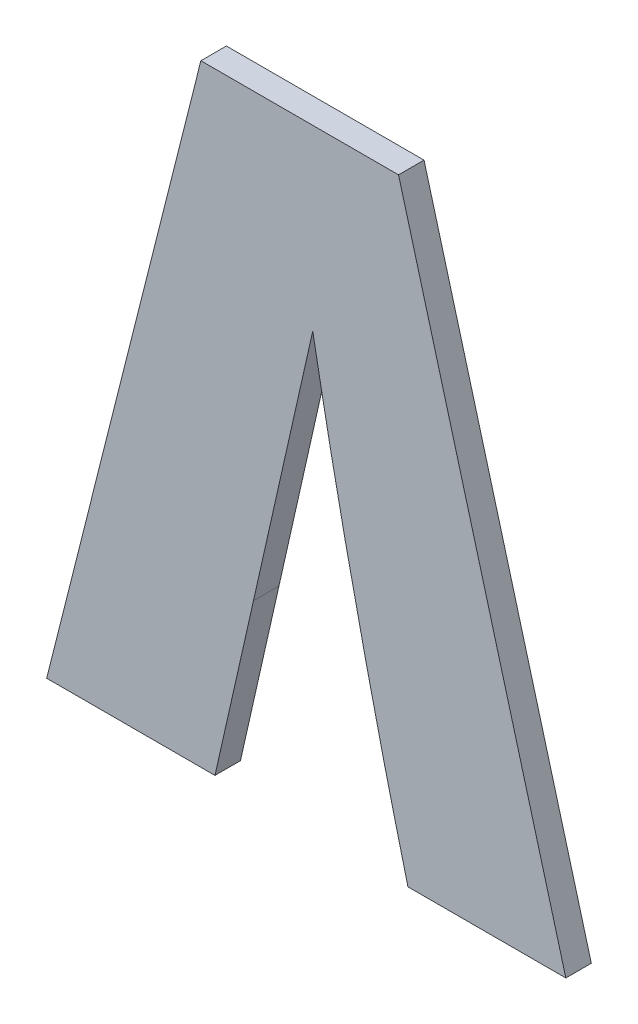
ISO-10303-21;
HEADER;
FILE_DESCRIPTION(('STEP AP214'),'2;1');
FILE_NAME('part.step','',(''),(''),'','','');
FILE_SCHEMA(('AUTOMOTIVE_DESIGN { 1 0 10303 214 1 1 1 1 }'));
ENDSEC;
DATA;
#1=APPLICATION_CONTEXT('core data for automotive mechanical design processes');
#2=APPLICATION_PROTOCOL_DEFINITION('international standard','automotive_design',2000,#1);
#3=PRODUCT_CONTEXT('',#1,'mechanical');
#4=PRODUCT('Part','Part','',(#3));
#5=PRODUCT_RELATED_PRODUCT_CATEGORY('part','',(#4));
#6=PRODUCT_DEFINITION_FORMATION('','',#4);
#7=PRODUCT_DEFINITION_CONTEXT('part definition',#1,'design');
#8=PRODUCT_DEFINITION('design','',#6,#7);
#9=PRODUCT_DEFINITION_SHAPE('','',#8);
#10=(LENGTH_UNIT() NAMED_UNIT(*) SI_UNIT(.MILLI.,.METRE.));
#11=(NAMED_UNIT(*) PLANE_ANGLE_UNIT() SI_UNIT($,.RADIAN.));
#12=(NAMED_UNIT(*) SI_UNIT($,.STERADIAN.) SOLID_ANGLE_UNIT());
#13=UNCERTAINTY_MEASURE_WITH_UNIT(LENGTH_MEASURE(1.E-05),#10,'distance_accuracy_value','');
#14=(GEOMETRIC_REPRESENTATION_CONTEXT(3) GLOBAL_UNCERTAINTY_ASSIGNED_CONTEXT((#13)) GLOBAL_UNIT_ASSIGNED_CONTEXT((#10,
#11,#12)) REPRESENTATION_CONTEXT('',''));
#15=CARTESIAN_POINT('',(0.,0.,0.));
#16=DIRECTION('',(0.,0.,1.));
#17=DIRECTION('',(1.,0.,0.));
#18=AXIS2_PLACEMENT_3D('',#15,#16,#17);
#19=CARTESIAN_POINT('',(-10.2063301282051,12.5,0.5));
#20=DIRECTION('',(0.,-1.,0.));
#21=DIRECTION('',(0.,0.,-1.));
#22=AXIS2_PLACEMENT_3D('',#19,#20,#21);
#23=PLANE('',#22);
#24=DIRECTION('',(1.,0.,0.));
#25=VECTOR('',#24,1.);
#26=CARTESIAN_POINT('',(-10.2063301282051,12.5,1.));
#27=LINE('',#26,#25);
#28=CARTESIAN_POINT('',(-10.2063301282051,12.5,1.));
#29=VERTEX_POINT('',#28);
#30=CARTESIAN_POINT('',(-6.33012820512821,12.5,1.));
#31=VERTEX_POINT('',#30);
#32=EDGE_CURVE('E121',#29,#31,#27,.T.);
#33=ORIENTED_EDGE('',*,*,#32,.T.);
#34=DIRECTION('',(0.,0.,1.));
#35=VECTOR('',#34,1.);
#36=CARTESIAN_POINT('',(-6.33012820512821,12.5,0.5));
#37=LINE('',#36,#35);
#38=CARTESIAN_POINT('',(-6.33012820512821,12.5,0.5));
#39=VERTEX_POINT('',#38);
#40=EDGE_CURVE('E134',#39,#31,#37,.T.);
#41=ORIENTED_EDGE('',*,*,#40,.F.);
#42=DIRECTION('',(1.,0.,0.));
#43=VECTOR('',#42,1.);
#44=CARTESIAN_POINT('',(-10.2063301282051,12.5,0.5));
#45=LINE('',#44,#43);
#46=CARTESIAN_POINT('',(-10.2063301282051,12.5,0.5));
#47=VERTEX_POINT('',#46);
#48=EDGE_CURVE('E210',#47,#39,#45,.T.);
#49=ORIENTED_EDGE('',*,*,#48,.F.);
#50=DIRECTION('',(0.,0.,1.));
#51=VECTOR('',#50,1.);
#52=CARTESIAN_POINT('',(-10.2063301282051,12.5,0.5));
#53=LINE('',#52,#51);
#54=EDGE_CURVE('E138',#47,#29,#53,.T.);
#55=ORIENTED_EDGE('',*,*,#54,.T.);
#56=EDGE_LOOP('',(#33,#41,#49,#55));
#57=FACE_BOUND('',#56,.T.);
#58=ADVANCED_FACE('F39',(#57),#23,.F.);
#59=CARTESIAN_POINT('',(-8.01282051282052,9.00440705128206,0.5));
#60=CARTESIAN_POINT('',(-8.09660975203797,8.63555596973446,0.5));
#61=CARTESIAN_POINT('',(-8.27361341265292,7.85636293414345,0.5));
#62=CARTESIAN_POINT('',(-8.54581373180322,6.62662536011861,0.5));
#63=CARTESIAN_POINT('',(-8.85474960034038,5.27728414158836,0.5));
#64=CARTESIAN_POINT('',(-9.06494207937523,4.33703805332426,0.5));
#65=CARTESIAN_POINT('',(-9.1746794871795,3.84615384615385,0.5));
#66=B_SPLINE_CURVE_WITH_KNOTS('',3,(#59,#60,#61,#62,#63,#64,#65),.UNSPECIFIED.,.F.,.F.,(4,1,1,1,
4),(0.,0.214609114344812,0.453358918103799,0.714609316175079,1.),.UNSPECIFIED.);
#67=DIRECTION('',(0.,0.,1.));
#68=VECTOR('',#67,1.);
#69=SURFACE_OF_LINEAR_EXTRUSION('',#66,#68);
#70=CARTESIAN_POINT('',(-8.01282051282052,9.00440705128206,1.));
#71=CARTESIAN_POINT('',(-8.09660975203797,8.63555596973446,1.));
#72=CARTESIAN_POINT('',(-8.27361341265292,7.85636293414345,1.));
#73=CARTESIAN_POINT('',(-8.54581373180322,6.62662536011861,1.));
#74=CARTESIAN_POINT('',(-8.85474960034038,5.27728414158836,1.));
#75=CARTESIAN_POINT('',(-9.06494207937523,4.33703805332426,1.));
#76=CARTESIAN_POINT('',(-9.1746794871795,3.84615384615385,1.));
#77=B_SPLINE_CURVE_WITH_KNOTS('',3,(#70,#71,#72,#73,#74,#75,#76),.UNSPECIFIED.,.F.,.F.,(4,1,1,1,
4),(0.,0.214609114344812,0.453358918103799,0.714609316175079,1.),.UNSPECIFIED.);
#78=CARTESIAN_POINT('',(-8.01282051282052,9.00440705128205,1.));
#79=VERTEX_POINT('',#78);
#80=CARTESIAN_POINT('',(-9.1746794871795,3.84615384615385,1.));
#81=VERTEX_POINT('',#80);
#82=EDGE_CURVE('E126',#79,#81,#77,.T.);
#83=ORIENTED_EDGE('',*,*,#82,.T.);
#84=DIRECTION('',(0.,0.,1.));
#85=VECTOR('',#84,1.);
#86=CARTESIAN_POINT('',(-9.1746794871795,3.84615384615385,0.5));
#87=LINE('',#86,#85);
#88=CARTESIAN_POINT('',(-9.1746794871795,3.84615384615385,0.5));
#89=VERTEX_POINT('',#88);
#90=EDGE_CURVE('E139',#89,#81,#87,.T.);
#91=ORIENTED_EDGE('',*,*,#90,.F.);
#92=CARTESIAN_POINT('',(-8.01282051282052,9.00440705128205,0.5));
#93=VERTEX_POINT('',#92);
#94=EDGE_CURVE('E161',#93,#89,#66,.T.);
#95=ORIENTED_EDGE('',*,*,#94,.F.);
#96=DIRECTION('',(0.,0.,1.));
#97=VECTOR('',#96,1.);
#98=CARTESIAN_POINT('',(-8.01282051282052,9.00440705128205,0.5));
#99=LINE('',#98,#97);
#100=EDGE_CURVE('E42',#93,#79,#99,.T.);
#101=ORIENTED_EDGE('',*,*,#100,.T.);
#102=EDGE_LOOP('',(#83,#91,#95,#101));
#103=FACE_BOUND('',#102,.T.);
#104=ADVANCED_FACE('F180',(#103),#69,.F.);
#105=CARTESIAN_POINT('',(8.5816551653171,6.47238776818213,0.5));
#106=DIRECTION('',(0.,0.,1.));
#107=DIRECTION('',(1.,0.,0.));
#108=AXIS2_PLACEMENT_3D('',#105,#106,#107);
#109=PLANE('',#108);
#110=DIRECTION('',(0.263716401102366,-0.9646002590657,0.));
#111=VECTOR('',#110,1.);
#112=CARTESIAN_POINT('',(-6.33012820512821,12.5,0.5));
#113=LINE('',#112,#111);
#114=CARTESIAN_POINT('',(-3.04939426017408,0.500000000000001,0.499999999999678));
#115=VERTEX_POINT('',#114);
#116=EDGE_CURVE('E137',#39,#115,#113,.T.);
#117=ORIENTED_EDGE('',*,*,#116,.T.);
#118=DIRECTION('',(-1.,0.,0.));
#119=VECTOR('',#118,1.);
#120=CARTESIAN_POINT('',(8.5816551653171,0.5,0.499999999999933));
#121=LINE('',#120,#119);
#122=CARTESIAN_POINT('',(-6.1455064500332,0.500000009757212,0.5));
#123=VERTEX_POINT('',#122);
#124=EDGE_CURVE('E155',#115,#123,#121,.T.);
#125=ORIENTED_EDGE('',*,*,#124,.T.);
#126=CARTESIAN_POINT('',(-6.02463942307693,0.0250400641025657,0.5));
#127=CARTESIAN_POINT('',(-6.22169306657345,0.798787915679086,0.5));
#128=CARTESIAN_POINT('',(-6.61024020536264,2.32445122512021,0.5));
#129=CARTESIAN_POINT('',(-7.12648779088988,4.59698323949022,0.5));
#130=CARTESIAN_POINT('',(-7.60296781350533,6.81438316711035,0.5));
#131=CARTESIAN_POINT('',(-7.87742925379717,8.28095179171039,0.5));
#132=CARTESIAN_POINT('',(-8.01282051282052,9.00440705128205,0.5));
#133=B_SPLINE_CURVE_WITH_KNOTS('',3,(#126,#127,#128,#129,#130,#131,#132),.UNSPECIFIED.,.F.,.F.,
(4,1,1,1,4),(0.,0.260386142524085,0.513425120504667,0.759973621525999,1.),.UNSPECIFIED.);
#134=EDGE_CURVE('E132',#123,#93,#133,.T.);
#135=ORIENTED_EDGE('',*,*,#134,.T.);
#136=ORIENTED_EDGE('',*,*,#94,.T.);
#137=DIRECTION('',(-0.220251698832426,-0.975443073255139,0.));
#138=VECTOR('',#137,1.);
#139=CARTESIAN_POINT('',(-9.1746794871795,3.84615384615385,0.5));
#140=LINE('',#139,#138);
#141=CARTESIAN_POINT('',(-9.93022954374058,0.500000000000001,0.499999999999507));
#142=VERTEX_POINT('',#141);
#143=EDGE_CURVE('E175',#89,#142,#140,.T.);
#144=ORIENTED_EDGE('',*,*,#143,.T.);
#145=CARTESIAN_POINT('',(-13.2303685897436,0.5,0.499999999999425));
#146=VERTEX_POINT('',#145);
#147=EDGE_CURVE('E120',#142,#146,#121,.T.);
#148=ORIENTED_EDGE('',*,*,#147,.T.);
#149=DIRECTION('',(0.244363406533017,0.969683724493497,0.));
#150=VECTOR('',#149,1.);
#151=CARTESIAN_POINT('',(-16.5064102564103,-12.5,0.5));
#152=LINE('',#151,#150);
#153=EDGE_CURVE('E119',#146,#47,#152,.T.);
#154=ORIENTED_EDGE('',*,*,#153,.T.);
#155=ORIENTED_EDGE('',*,*,#48,.T.);
#156=EDGE_LOOP('',(#117,#125,#135,#136,#144,#148,#154,#155));
#157=FACE_BOUND('',#156,.T.);
#158=ADVANCED_FACE('F179',(#157),#109,.F.);
#159=CARTESIAN_POINT('',(-6.33012820512821,12.5,0.5));
#160=DIRECTION('',(-0.9646002590657,-0.263716401102366,0.));
#161=DIRECTION('',(0.263716401102366,-0.9646002590657,0.));
#162=AXIS2_PLACEMENT_3D('',#159,#160,#161);
#163=PLANE('',#162);
#164=DIRECTION('',(0.263716401102366,-0.9646002590657,0.));
#165=VECTOR('',#164,1.);
#166=CARTESIAN_POINT('',(-6.33012820512821,12.5,1.));
#167=LINE('',#166,#165);
#168=CARTESIAN_POINT('',(-3.04939426017408,0.5,1.));
#169=VERTEX_POINT('',#168);
#170=EDGE_CURVE('E128',#31,#169,#167,.T.);
#171=ORIENTED_EDGE('',*,*,#170,.T.);
#172=DIRECTION('',(0.,0.,-1.));
#173=VECTOR('',#172,1.);
#174=CARTESIAN_POINT('',(-3.04939426017408,0.5,0.5));
#175=LINE('',#174,#173);
#176=EDGE_CURVE('E157',#169,#115,#175,.T.);
#177=ORIENTED_EDGE('',*,*,#176,.T.);
#178=ORIENTED_EDGE('',*,*,#116,.F.);
#179=ORIENTED_EDGE('',*,*,#40,.T.);
#180=EDGE_LOOP('',(#171,#177,#178,#179));
#181=FACE_BOUND('',#180,.T.);
#182=ADVANCED_FACE('F186',(#181),#163,.F.);
#183=CARTESIAN_POINT('',(-16.5064102564103,-12.5,0.5));
#184=DIRECTION('',(0.969683724493497,-0.244363406533017,0.));
#185=DIRECTION('',(0.244363406533017,0.969683724493497,0.));
#186=AXIS2_PLACEMENT_3D('',#183,#184,#185);
#187=PLANE('',#186);
#188=ORIENTED_EDGE('',*,*,#153,.F.);
#189=DIRECTION('',(0.,0.,1.));
#190=VECTOR('',#189,1.);
#191=CARTESIAN_POINT('',(-13.2303685897436,0.5,0.5));
#192=LINE('',#191,#190);
#193=CARTESIAN_POINT('',(-13.2303685897436,0.5,1.));
#194=VERTEX_POINT('',#193);
#195=EDGE_CURVE('E60',#146,#194,#192,.T.);
#196=ORIENTED_EDGE('',*,*,#195,.T.);
#197=DIRECTION('',(0.244363406533017,0.969683724493497,0.));
#198=VECTOR('',#197,1.);
#199=CARTESIAN_POINT('',(-16.5064102564103,-12.5,1.));
#200=LINE('',#199,#198);
#201=EDGE_CURVE('E113',#194,#29,#200,.T.);
#202=ORIENTED_EDGE('',*,*,#201,.T.);
#203=ORIENTED_EDGE('',*,*,#54,.F.);
#204=EDGE_LOOP('',(#188,#196,#202,#203));
#205=FACE_BOUND('',#204,.T.);
#206=ADVANCED_FACE('F111',(#205),#187,.F.);
#207=CARTESIAN_POINT('',(-9.1746794871795,3.84615384615385,0.5));
#208=DIRECTION('',(-0.975443073255139,0.220251698832426,0.));
#209=DIRECTION('',(-0.220251698832426,-0.975443073255139,0.));
#210=AXIS2_PLACEMENT_3D('',#207,#208,#209);
#211=PLANE('',#210);
#212=DIRECTION('',(-0.220251698832426,-0.975443073255139,0.));
#213=VECTOR('',#212,1.);
#214=CARTESIAN_POINT('',(-9.1746794871795,3.84615384615385,1.));
#215=LINE('',#214,#213);
#216=CARTESIAN_POINT('',(-9.93022954374058,0.5,1.));
#217=VERTEX_POINT('',#216);
#218=EDGE_CURVE('E125',#81,#217,#215,.T.);
#219=ORIENTED_EDGE('',*,*,#218,.T.);
#220=DIRECTION('',(0.,0.,-1.));
#221=VECTOR('',#220,1.);
#222=CARTESIAN_POINT('',(-9.93022954374058,0.5,0.5));
#223=LINE('',#222,#221);
#224=EDGE_CURVE('E107',#217,#142,#223,.T.);
#225=ORIENTED_EDGE('',*,*,#224,.T.);
#226=ORIENTED_EDGE('',*,*,#143,.F.);
#227=ORIENTED_EDGE('',*,*,#90,.T.);
#228=EDGE_LOOP('',(#219,#225,#226,#227));
#229=FACE_BOUND('',#228,.T.);
#230=ADVANCED_FACE('F181',(#229),#211,.F.);
#231=DIRECTION('',(0.,0.,1.));
#232=VECTOR('',#231,1.);
#233=SURFACE_OF_LINEAR_EXTRUSION('',#133,#232);
#234=ORIENTED_EDGE('',*,*,#134,.F.);
#235=DIRECTION('',(0.,0.,1.));
#236=VECTOR('',#235,1.);
#237=CARTESIAN_POINT('',(-6.14550644755402,0.5,0.5));
#238=LINE('',#237,#236);
#239=CARTESIAN_POINT('',(-6.1455064500332,0.5,1.));
#240=VERTEX_POINT('',#239);
#241=EDGE_CURVE('E63',#123,#240,#238,.T.);
#242=ORIENTED_EDGE('',*,*,#241,.T.);
#243=CARTESIAN_POINT('',(-6.02463942307693,0.0250400641025657,1.));
#244=CARTESIAN_POINT('',(-6.22169306657345,0.798787915679086,1.));
#245=CARTESIAN_POINT('',(-6.61024020536264,2.32445122512021,1.));
#246=CARTESIAN_POINT('',(-7.12648779088988,4.59698323949022,1.));
#247=CARTESIAN_POINT('',(-7.60296781350533,6.81438316711035,1.));
#248=CARTESIAN_POINT('',(-7.87742925379717,8.28095179171039,1.));
#249=CARTESIAN_POINT('',(-8.01282051282052,9.00440705128205,1.));
#250=B_SPLINE_CURVE_WITH_KNOTS('',3,(#243,#244,#245,#246,#247,#248,#249),.UNSPECIFIED.,.F.,.F.,
(4,1,1,1,4),(0.,0.260386142524085,0.513425120504667,0.759973621525999,1.),.UNSPECIFIED.);
#251=EDGE_CURVE('E159',#240,#79,#250,.T.);
#252=ORIENTED_EDGE('',*,*,#251,.T.);
#253=ORIENTED_EDGE('',*,*,#100,.F.);
#254=EDGE_LOOP('',(#234,#242,#252,#253));
#255=FACE_BOUND('',#254,.T.);
#256=ADVANCED_FACE('F41',(#255),#233,.F.);
#257=CARTESIAN_POINT('',(8.5816551653171,6.47238776818213,1.));
#258=DIRECTION('',(0.,0.,1.));
#259=DIRECTION('',(1.,0.,0.));
#260=AXIS2_PLACEMENT_3D('',#257,#258,#259);
#261=PLANE('',#260);
#262=ORIENTED_EDGE('',*,*,#201,.F.);
#263=DIRECTION('',(1.,0.,0.));
#264=VECTOR('',#263,1.);
#265=CARTESIAN_POINT('',(-17.,0.5,1.));
#266=LINE('',#265,#264);
#267=EDGE_CURVE('E11',#194,#217,#266,.T.);
#268=ORIENTED_EDGE('',*,*,#267,.T.);
#269=ORIENTED_EDGE('',*,*,#218,.F.);
#270=ORIENTED_EDGE('',*,*,#82,.F.);
#271=ORIENTED_EDGE('',*,*,#251,.F.);
#272=EDGE_CURVE('E47',#240,#169,#266,.T.);
#273=ORIENTED_EDGE('',*,*,#272,.T.);
#274=ORIENTED_EDGE('',*,*,#170,.F.);
#275=ORIENTED_EDGE('',*,*,#32,.F.);
#276=EDGE_LOOP('',(#262,#268,#269,#270,#271,#273,#274,#275));
#277=FACE_BOUND('',#276,.T.);
#278=ADVANCED_FACE('F123',(#277),#261,.T.);
#279=CARTESIAN_POINT('',(-17.,0.5,1.));
#280=DIRECTION('',(0.,1.,0.));
#281=DIRECTION('',(0.,0.,1.));
#282=AXIS2_PLACEMENT_3D('',#279,#280,#281);
#283=PLANE('',#282);
#284=ORIENTED_EDGE('',*,*,#267,.F.);
#285=ORIENTED_EDGE('',*,*,#195,.F.);
#286=ORIENTED_EDGE('',*,*,#147,.F.);
#287=ORIENTED_EDGE('',*,*,#224,.F.);
#288=EDGE_LOOP('',(#284,#285,#286,#287));
#289=FACE_BOUND('',#288,.T.);
#290=ADVANCED_FACE('F101',(#289),#283,.F.);
#291=ORIENTED_EDGE('',*,*,#124,.F.);
#292=ORIENTED_EDGE('',*,*,#176,.F.);
#293=ORIENTED_EDGE('',*,*,#272,.F.);
#294=ORIENTED_EDGE('',*,*,#241,.F.);
#295=EDGE_LOOP('',(#291,#292,#293,#294));
#296=FACE_BOUND('',#295,.T.);
#297=ADVANCED_FACE('F200',(#296),#283,.F.);
#298=CLOSED_SHELL('',(#58,#104,#158,#182,#206,#230,#256,#278,#290,#297));
#299=MANIFOLD_SOLID_BREP('B2',#298);
#300=ADVANCED_BREP_SHAPE_REPRESENTATION('',(#18,#299),#14);
#301=SHAPE_DEFINITION_REPRESENTATION(#9,#300);
ENDSEC;
END-ISO-10303-21;
